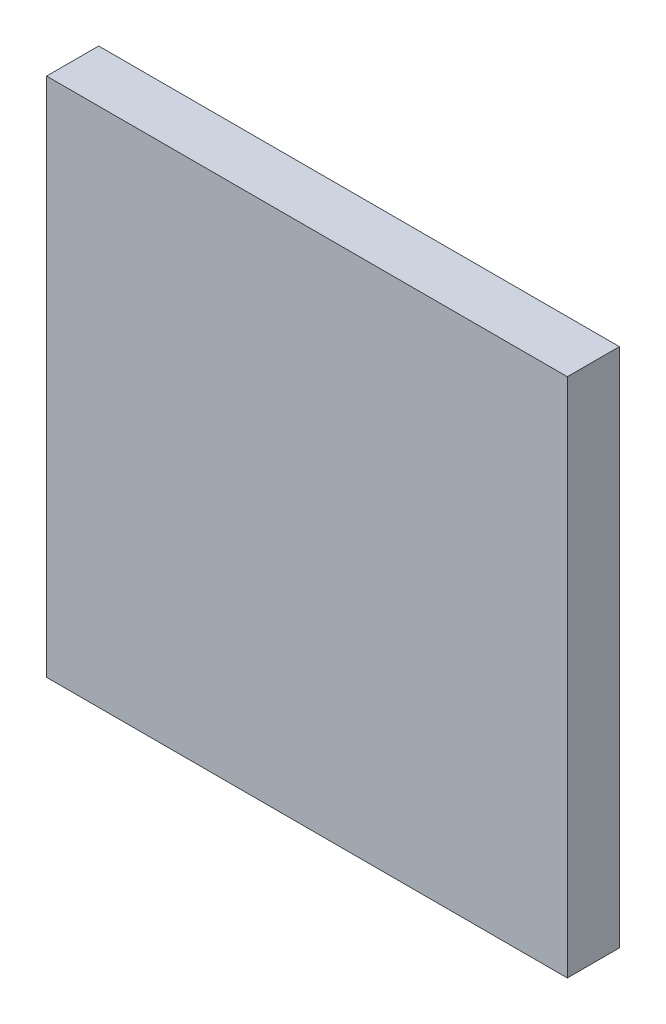
ISO-10303-21;
HEADER;
FILE_DESCRIPTION(('STEP AP214'),'2;1');
FILE_NAME('part.step','',(''),(''),'','','');
FILE_SCHEMA(('AUTOMOTIVE_DESIGN { 1 0 10303 214 1 1 1 1 }'));
ENDSEC;
DATA;
#1=APPLICATION_CONTEXT('core data for automotive mechanical design processes');
#2=APPLICATION_PROTOCOL_DEFINITION('international standard','automotive_design',2000,#1);
#3=PRODUCT_CONTEXT('',#1,'mechanical');
#4=PRODUCT('Part','Part','',(#3));
#5=PRODUCT_RELATED_PRODUCT_CATEGORY('part','',(#4));
#6=PRODUCT_DEFINITION_FORMATION('','',#4);
#7=PRODUCT_DEFINITION_CONTEXT('part definition',#1,'design');
#8=PRODUCT_DEFINITION('design','',#6,#7);
#9=PRODUCT_DEFINITION_SHAPE('','',#8);
#10=(LENGTH_UNIT() NAMED_UNIT(*) SI_UNIT(.MILLI.,.METRE.));
#11=(NAMED_UNIT(*) PLANE_ANGLE_UNIT() SI_UNIT($,.RADIAN.));
#12=(NAMED_UNIT(*) SI_UNIT($,.STERADIAN.) SOLID_ANGLE_UNIT());
#13=UNCERTAINTY_MEASURE_WITH_UNIT(LENGTH_MEASURE(1.E-05),#10,'distance_accuracy_value','');
#14=(GEOMETRIC_REPRESENTATION_CONTEXT(3) GLOBAL_UNCERTAINTY_ASSIGNED_CONTEXT((#13)) GLOBAL_UNIT_ASSIGNED_CONTEXT((#10,
#11,#12)) REPRESENTATION_CONTEXT('',''));
#15=CARTESIAN_POINT('',(0.,0.,0.));
#16=DIRECTION('',(0.,0.,1.));
#17=DIRECTION('',(1.,0.,0.));
#18=AXIS2_PLACEMENT_3D('',#15,#16,#17);
#19=CARTESIAN_POINT('',(0.,0.,3.));
#20=DIRECTION('',(1.,0.,0.));
#21=DIRECTION('',(0.,0.,-1.));
#22=AXIS2_PLACEMENT_3D('',#19,#20,#21);
#23=PLANE('',#22);
#24=DIRECTION('',(0.,-1.,0.));
#25=VECTOR('',#24,1.);
#26=CARTESIAN_POINT('',(0.,0.,0.));
#27=LINE('',#26,#25);
#28=CARTESIAN_POINT('',(0.,0.,0.));
#29=VERTEX_POINT('',#28);
#30=CARTESIAN_POINT('',(0.,-30.,0.));
#31=VERTEX_POINT('',#30);
#32=EDGE_CURVE('E106',#29,#31,#27,.T.);
#33=ORIENTED_EDGE('',*,*,#32,.T.);
#34=DIRECTION('',(0.,0.,-1.));
#35=VECTOR('',#34,1.);
#36=CARTESIAN_POINT('',(0.,-30.,3.));
#37=LINE('',#36,#35);
#38=CARTESIAN_POINT('',(0.,-30.,3.));
#39=VERTEX_POINT('',#38);
#40=EDGE_CURVE('E11',#39,#31,#37,.T.);
#41=ORIENTED_EDGE('',*,*,#40,.F.);
#42=DIRECTION('',(0.,-1.,0.));
#43=VECTOR('',#42,1.);
#44=CARTESIAN_POINT('',(0.,0.,3.));
#45=LINE('',#44,#43);
#46=CARTESIAN_POINT('',(0.,0.,3.));
#47=VERTEX_POINT('',#46);
#48=EDGE_CURVE('E131',#47,#39,#45,.T.);
#49=ORIENTED_EDGE('',*,*,#48,.F.);
#50=DIRECTION('',(0.,0.,-1.));
#51=VECTOR('',#50,1.);
#52=CARTESIAN_POINT('',(0.,0.,3.));
#53=LINE('',#52,#51);
#54=EDGE_CURVE('E141',#47,#29,#53,.T.);
#55=ORIENTED_EDGE('',*,*,#54,.T.);
#56=EDGE_LOOP('',(#33,#41,#49,#55));
#57=FACE_BOUND('',#56,.T.);
#58=ADVANCED_FACE('F33',(#57),#23,.F.);
#59=CARTESIAN_POINT('',(0.,-30.,3.));
#60=DIRECTION('',(0.,1.,0.));
#61=DIRECTION('',(0.,0.,1.));
#62=AXIS2_PLACEMENT_3D('',#59,#60,#61);
#63=PLANE('',#62);
#64=DIRECTION('',(1.,0.,0.));
#65=VECTOR('',#64,1.);
#66=CARTESIAN_POINT('',(0.,-30.,0.));
#67=LINE('',#66,#65);
#68=CARTESIAN_POINT('',(30.,-30.,0.));
#69=VERTEX_POINT('',#68);
#70=EDGE_CURVE('E144',#31,#69,#67,.T.);
#71=ORIENTED_EDGE('',*,*,#70,.T.);
#72=DIRECTION('',(0.,0.,-1.));
#73=VECTOR('',#72,1.);
#74=CARTESIAN_POINT('',(30.,-30.,3.));
#75=LINE('',#74,#73);
#76=CARTESIAN_POINT('',(30.,-30.,3.));
#77=VERTEX_POINT('',#76);
#78=EDGE_CURVE('E40',#77,#69,#75,.T.);
#79=ORIENTED_EDGE('',*,*,#78,.F.);
#80=DIRECTION('',(1.,0.,0.));
#81=VECTOR('',#80,1.);
#82=CARTESIAN_POINT('',(0.,-30.,3.));
#83=LINE('',#82,#81);
#84=EDGE_CURVE('E134',#39,#77,#83,.T.);
#85=ORIENTED_EDGE('',*,*,#84,.F.);
#86=ORIENTED_EDGE('',*,*,#40,.T.);
#87=EDGE_LOOP('',(#71,#79,#85,#86));
#88=FACE_BOUND('',#87,.T.);
#89=ADVANCED_FACE('F172',(#88),#63,.F.);
#90=CARTESIAN_POINT('',(30.,0.,3.));
#91=DIRECTION('',(-1.,0.,0.));
#92=DIRECTION('',(0.,-1.,0.));
#93=AXIS2_PLACEMENT_3D('',#90,#91,#92);
#94=PLANE('',#93);
#95=DIRECTION('',(0.,1.,0.));
#96=VECTOR('',#95,1.);
#97=CARTESIAN_POINT('',(30.,0.,0.));
#98=LINE('',#97,#96);
#99=CARTESIAN_POINT('',(30.,0.,0.));
#100=VERTEX_POINT('',#99);
#101=EDGE_CURVE('E146',#69,#100,#98,.T.);
#102=ORIENTED_EDGE('',*,*,#101,.T.);
#103=DIRECTION('',(0.,0.,-1.));
#104=VECTOR('',#103,1.);
#105=CARTESIAN_POINT('',(30.,0.,3.));
#106=LINE('',#105,#104);
#107=CARTESIAN_POINT('',(30.,0.,3.));
#108=VERTEX_POINT('',#107);
#109=EDGE_CURVE('E151',#108,#100,#106,.T.);
#110=ORIENTED_EDGE('',*,*,#109,.F.);
#111=DIRECTION('',(0.,1.,0.));
#112=VECTOR('',#111,1.);
#113=CARTESIAN_POINT('',(30.,0.,3.));
#114=LINE('',#113,#112);
#115=EDGE_CURVE('E137',#77,#108,#114,.T.);
#116=ORIENTED_EDGE('',*,*,#115,.F.);
#117=ORIENTED_EDGE('',*,*,#78,.T.);
#118=EDGE_LOOP('',(#102,#110,#116,#117));
#119=FACE_BOUND('',#118,.T.);
#120=ADVANCED_FACE('F158',(#119),#94,.F.);
#121=CARTESIAN_POINT('',(0.,0.,3.));
#122=DIRECTION('',(0.,-1.,0.));
#123=DIRECTION('',(0.,0.,-1.));
#124=AXIS2_PLACEMENT_3D('',#121,#122,#123);
#125=PLANE('',#124);
#126=DIRECTION('',(-1.,0.,0.));
#127=VECTOR('',#126,1.);
#128=CARTESIAN_POINT('',(0.,0.,0.));
#129=LINE('',#128,#127);
#130=EDGE_CURVE('E135',#100,#29,#129,.T.);
#131=ORIENTED_EDGE('',*,*,#130,.T.);
#132=ORIENTED_EDGE('',*,*,#54,.F.);
#133=DIRECTION('',(-1.,0.,0.));
#134=VECTOR('',#133,1.);
#135=CARTESIAN_POINT('',(0.,0.,3.));
#136=LINE('',#135,#134);
#137=EDGE_CURVE('E139',#108,#47,#136,.T.);
#138=ORIENTED_EDGE('',*,*,#137,.F.);
#139=ORIENTED_EDGE('',*,*,#109,.T.);
#140=EDGE_LOOP('',(#131,#132,#138,#139));
#141=FACE_BOUND('',#140,.T.);
#142=ADVANCED_FACE('F165',(#141),#125,.F.);
#143=CARTESIAN_POINT('',(0.,0.,3.));
#144=DIRECTION('',(0.,0.,1.));
#145=DIRECTION('',(1.,0.,0.));
#146=AXIS2_PLACEMENT_3D('',#143,#144,#145);
#147=PLANE('',#146);
#148=ORIENTED_EDGE('',*,*,#48,.T.);
#149=ORIENTED_EDGE('',*,*,#84,.T.);
#150=ORIENTED_EDGE('',*,*,#115,.T.);
#151=ORIENTED_EDGE('',*,*,#137,.T.);
#152=EDGE_LOOP('',(#148,#149,#150,#151));
#153=FACE_BOUND('',#152,.T.);
#154=ADVANCED_FACE('F171',(#153),#147,.T.);
#155=CARTESIAN_POINT('',(0.,0.,0.));
#156=DIRECTION('',(0.,0.,1.));
#157=DIRECTION('',(1.,0.,0.));
#158=AXIS2_PLACEMENT_3D('',#155,#156,#157);
#159=PLANE('',#158);
#160=DIRECTION('',(1.,0.,0.));
#161=VECTOR('',#160,1.);
#162=CARTESIAN_POINT('',(12.5,-12.1733242783253,0.));
#163=LINE('',#162,#161);
#164=CARTESIAN_POINT('',(12.5,-12.1733242783253,0.));
#165=VERTEX_POINT('',#164);
#166=CARTESIAN_POINT('',(17.5,-12.1733242783253,0.));
#167=VERTEX_POINT('',#166);
#168=EDGE_CURVE('E47',#165,#167,#163,.T.);
#169=ORIENTED_EDGE('',*,*,#168,.F.);
#170=DIRECTION('',(0.,1.,0.));
#171=VECTOR('',#170,1.);
#172=CARTESIAN_POINT('',(12.5,-12.1733242783253,0.));
#173=LINE('',#172,#171);
#174=CARTESIAN_POINT('',(12.5,-13.6733242783253,0.));
#175=VERTEX_POINT('',#174);
#176=EDGE_CURVE('E51',#175,#165,#173,.T.);
#177=ORIENTED_EDGE('',*,*,#176,.F.);
#178=DIRECTION('',(1.,0.,0.));
#179=VECTOR('',#178,1.);
#180=CARTESIAN_POINT('',(12.5,-13.6733242783253,0.));
#181=LINE('',#180,#179);
#182=CARTESIAN_POINT('',(17.5,-13.6733242783253,0.));
#183=VERTEX_POINT('',#182);
#184=EDGE_CURVE('E128',#175,#183,#181,.T.);
#185=ORIENTED_EDGE('',*,*,#184,.T.);
#186=DIRECTION('',(0.,1.,0.));
#187=VECTOR('',#186,1.);
#188=CARTESIAN_POINT('',(17.5,-12.1733242783253,0.));
#189=LINE('',#188,#187);
#190=EDGE_CURVE('E124',#183,#167,#189,.T.);
#191=ORIENTED_EDGE('',*,*,#190,.T.);
#192=EDGE_LOOP('',(#169,#177,#185,#191));
#193=FACE_BOUND('',#192,.T.);
#194=DIRECTION('',(1.,0.,0.));
#195=VECTOR('',#194,1.);
#196=CARTESIAN_POINT('',(12.5,-16.8399909449919,0.));
#197=LINE('',#196,#195);
#198=CARTESIAN_POINT('',(12.5,-16.8399909449919,0.));
#199=VERTEX_POINT('',#198);
#200=CARTESIAN_POINT('',(17.5,-16.8399909449919,0.));
#201=VERTEX_POINT('',#200);
#202=EDGE_CURVE('E107',#199,#201,#197,.T.);
#203=ORIENTED_EDGE('',*,*,#202,.F.);
#204=DIRECTION('',(0.,1.,0.));
#205=VECTOR('',#204,1.);
#206=CARTESIAN_POINT('',(12.5,-16.8399909449919,0.));
#207=LINE('',#206,#205);
#208=CARTESIAN_POINT('',(12.5,-18.3399909449919,0.));
#209=VERTEX_POINT('',#208);
#210=EDGE_CURVE('E101',#209,#199,#207,.T.);
#211=ORIENTED_EDGE('',*,*,#210,.F.);
#212=DIRECTION('',(1.,0.,0.));
#213=VECTOR('',#212,1.);
#214=CARTESIAN_POINT('',(12.5,-18.3399909449919,0.));
#215=LINE('',#214,#213);
#216=CARTESIAN_POINT('',(17.5,-18.3399909449919,0.));
#217=VERTEX_POINT('',#216);
#218=EDGE_CURVE('E94',#209,#217,#215,.T.);
#219=ORIENTED_EDGE('',*,*,#218,.T.);
#220=DIRECTION('',(0.,1.,0.));
#221=VECTOR('',#220,1.);
#222=CARTESIAN_POINT('',(17.5,-16.8399909449919,0.));
#223=LINE('',#222,#221);
#224=EDGE_CURVE('E98',#217,#201,#223,.T.);
#225=ORIENTED_EDGE('',*,*,#224,.T.);
#226=EDGE_LOOP('',(#203,#211,#219,#225));
#227=FACE_BOUND('',#226,.T.);
#228=ORIENTED_EDGE('',*,*,#32,.F.);
#229=ORIENTED_EDGE('',*,*,#130,.F.);
#230=ORIENTED_EDGE('',*,*,#101,.F.);
#231=ORIENTED_EDGE('',*,*,#70,.F.);
#232=EDGE_LOOP('',(#228,#229,#230,#231));
#233=FACE_BOUND('',#232,.T.);
#234=ADVANCED_FACE('F96',(#193,#227,#233),#159,.F.);
#235=CARTESIAN_POINT('',(12.5,-15.2566576116586,-2.54814747523678));
#236=DIRECTION('',(1.,0.,0.));
#237=DIRECTION('',(0.,0.,-1.));
#238=AXIS2_PLACEMENT_3D('',#235,#236,#237);
#239=CYLINDRICAL_SURFACE('',#238,4.);
#240=CARTESIAN_POINT('',(17.5,-15.2566576116586,-2.54814747523678));
#241=DIRECTION('',(-1.,0.,0.));
#242=DIRECTION('',(0.,0.,1.));
#243=AXIS2_PLACEMENT_3D('',#240,#241,#242);
#244=CIRCLE('',#243,4.);
#245=EDGE_CURVE('E114',#167,#217,#244,.T.);
#246=ORIENTED_EDGE('',*,*,#245,.T.);
#247=ORIENTED_EDGE('',*,*,#218,.F.);
#248=CARTESIAN_POINT('',(12.5,-15.2566576116586,-2.54814747523678));
#249=DIRECTION('',(-1.,0.,0.));
#250=DIRECTION('',(0.,0.,1.));
#251=AXIS2_PLACEMENT_3D('',#248,#249,#250);
#252=CIRCLE('',#251,4.);
#253=EDGE_CURVE('E126',#165,#209,#252,.T.);
#254=ORIENTED_EDGE('',*,*,#253,.F.);
#255=ORIENTED_EDGE('',*,*,#168,.T.);
#256=EDGE_LOOP('',(#246,#247,#254,#255));
#257=FACE_BOUND('',#256,.T.);
#258=ADVANCED_FACE('F118',(#257),#239,.T.);
#259=CARTESIAN_POINT('',(12.5,-15.2566576116586,-2.54814747523678));
#260=DIRECTION('',(1.,0.,0.));
#261=DIRECTION('',(0.,0.,-1.));
#262=AXIS2_PLACEMENT_3D('',#259,#260,#261);
#263=CYLINDRICAL_SURFACE('',#262,3.);
#264=CARTESIAN_POINT('',(17.5,-15.2566576116586,-2.54814747523678));
#265=DIRECTION('',(1.,0.,0.));
#266=DIRECTION('',(0.,0.,1.));
#267=AXIS2_PLACEMENT_3D('',#264,#265,#266);
#268=CIRCLE('',#267,3.);
#269=EDGE_CURVE('E116',#201,#183,#268,.T.);
#270=ORIENTED_EDGE('',*,*,#269,.T.);
#271=ORIENTED_EDGE('',*,*,#184,.F.);
#272=CARTESIAN_POINT('',(12.5,-15.2566576116586,-2.54814747523678));
#273=DIRECTION('',(1.,0.,0.));
#274=DIRECTION('',(0.,0.,1.));
#275=AXIS2_PLACEMENT_3D('',#272,#273,#274);
#276=CIRCLE('',#275,3.);
#277=EDGE_CURVE('E201',#199,#175,#276,.T.);
#278=ORIENTED_EDGE('',*,*,#277,.F.);
#279=ORIENTED_EDGE('',*,*,#202,.T.);
#280=EDGE_LOOP('',(#270,#271,#278,#279));
#281=FACE_BOUND('',#280,.T.);
#282=ADVANCED_FACE('F188',(#281),#263,.F.);
#283=CARTESIAN_POINT('',(12.5,-15.2566576116586,-2.54814747523678));
#284=DIRECTION('',(-1.,0.,0.));
#285=DIRECTION('',(0.,0.,1.));
#286=AXIS2_PLACEMENT_3D('',#283,#284,#285);
#287=PLANE('',#286);
#288=ORIENTED_EDGE('',*,*,#253,.T.);
#289=ORIENTED_EDGE('',*,*,#210,.T.);
#290=ORIENTED_EDGE('',*,*,#277,.T.);
#291=ORIENTED_EDGE('',*,*,#176,.T.);
#292=EDGE_LOOP('',(#288,#289,#290,#291));
#293=FACE_BOUND('',#292,.T.);
#294=ADVANCED_FACE('F191',(#293),#287,.T.);
#295=CARTESIAN_POINT('',(17.5,-15.2566576116586,-2.54814747523678));
#296=DIRECTION('',(-1.,0.,0.));
#297=DIRECTION('',(0.,0.,1.));
#298=AXIS2_PLACEMENT_3D('',#295,#296,#297);
#299=PLANE('',#298);
#300=ORIENTED_EDGE('',*,*,#245,.F.);
#301=ORIENTED_EDGE('',*,*,#190,.F.);
#302=ORIENTED_EDGE('',*,*,#269,.F.);
#303=ORIENTED_EDGE('',*,*,#224,.F.);
#304=EDGE_LOOP('',(#300,#301,#302,#303));
#305=FACE_BOUND('',#304,.T.);
#306=ADVANCED_FACE('F112',(#305),#299,.F.);
#307=CLOSED_SHELL('',(#58,#89,#120,#142,#154,#234,#258,#282,#294,#306));
#308=MANIFOLD_SOLID_BREP('B2',#307);
#309=ADVANCED_BREP_SHAPE_REPRESENTATION('',(#18,#308),#14);
#310=SHAPE_DEFINITION_REPRESENTATION(#9,#309);
ENDSEC;
END-ISO-10303-21;
